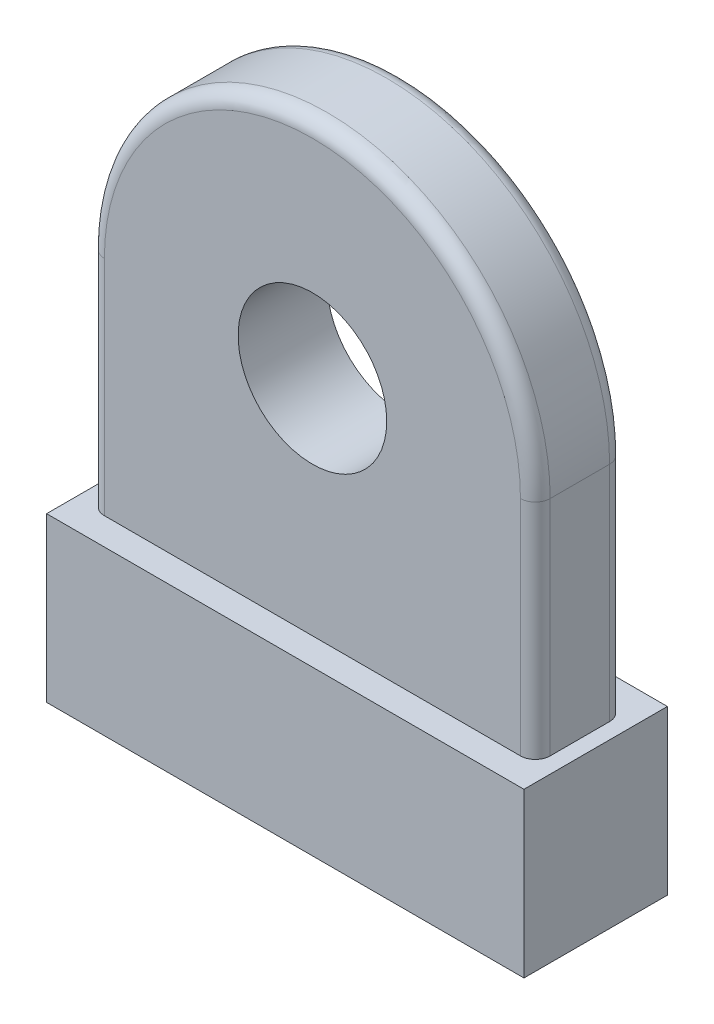
ISO-10303-21;
HEADER;
FILE_DESCRIPTION(('STEP AP214'),'2;1');
FILE_NAME('part.step','',(''),(''),'','','');
FILE_SCHEMA(('AUTOMOTIVE_DESIGN { 1 0 10303 214 1 1 1 1 }'));
ENDSEC;
DATA;
#1=APPLICATION_CONTEXT('core data for automotive mechanical design processes');
#2=APPLICATION_PROTOCOL_DEFINITION('international standard','automotive_design',2000,#1);
#3=PRODUCT_CONTEXT('',#1,'mechanical');
#4=PRODUCT('Part','Part','',(#3));
#5=PRODUCT_RELATED_PRODUCT_CATEGORY('part','',(#4));
#6=PRODUCT_DEFINITION_FORMATION('','',#4);
#7=PRODUCT_DEFINITION_CONTEXT('part definition',#1,'design');
#8=PRODUCT_DEFINITION('design','',#6,#7);
#9=PRODUCT_DEFINITION_SHAPE('','',#8);
#10=(LENGTH_UNIT() NAMED_UNIT(*) SI_UNIT(.MILLI.,.METRE.));
#11=(NAMED_UNIT(*) PLANE_ANGLE_UNIT() SI_UNIT($,.RADIAN.));
#12=(NAMED_UNIT(*) SI_UNIT($,.STERADIAN.) SOLID_ANGLE_UNIT());
#13=UNCERTAINTY_MEASURE_WITH_UNIT(LENGTH_MEASURE(1.E-05),#10,'distance_accuracy_value','');
#14=(GEOMETRIC_REPRESENTATION_CONTEXT(3) GLOBAL_UNCERTAINTY_ASSIGNED_CONTEXT((#13)) GLOBAL_UNIT_ASSIGNED_CONTEXT((#10,
#11,#12)) REPRESENTATION_CONTEXT('',''));
#15=CARTESIAN_POINT('',(0.,0.,0.));
#16=DIRECTION('',(0.,0.,1.));
#17=DIRECTION('',(1.,0.,0.));
#18=AXIS2_PLACEMENT_3D('',#15,#16,#17);
#19=CARTESIAN_POINT('',(0.,0.,6.));
#20=DIRECTION('',(0.,0.,1.));
#21=DIRECTION('',(1.,0.,0.));
#22=AXIS2_PLACEMENT_3D('',#19,#20,#21);
#23=PLANE('',#22);
#24=DIRECTION('',(1.,0.,0.));
#25=VECTOR('',#24,1.);
#26=CARTESIAN_POINT('',(-15.,-15.,6.));
#27=LINE('',#26,#25);
#28=CARTESIAN_POINT('',(-14.,-15.,6.));
#29=VERTEX_POINT('',#28);
#30=CARTESIAN_POINT('',(14.,-15.,6.));
#31=VERTEX_POINT('',#30);
#32=EDGE_CURVE('E195',#29,#31,#27,.T.);
#33=ORIENTED_EDGE('',*,*,#32,.T.);
#34=DIRECTION('',(0.,1.,0.));
#35=VECTOR('',#34,1.);
#36=CARTESIAN_POINT('',(14.,0.,6.));
#37=LINE('',#36,#35);
#38=CARTESIAN_POINT('',(14.,0.,6.));
#39=VERTEX_POINT('',#38);
#40=EDGE_CURVE('E259',#31,#39,#37,.T.);
#41=ORIENTED_EDGE('',*,*,#40,.T.);
#42=CARTESIAN_POINT('',(0.,0.,6.));
#43=DIRECTION('',(0.,0.,1.));
#44=DIRECTION('',(1.,0.,0.));
#45=AXIS2_PLACEMENT_3D('',#42,#43,#44);
#46=CIRCLE('',#45,14.);
#47=CARTESIAN_POINT('',(-14.,0.,6.));
#48=VERTEX_POINT('',#47);
#49=EDGE_CURVE('E57',#39,#48,#46,.T.);
#50=ORIENTED_EDGE('',*,*,#49,.T.);
#51=DIRECTION('',(0.,-1.,0.));
#52=VECTOR('',#51,1.);
#53=CARTESIAN_POINT('',(-14.,-15.,6.));
#54=LINE('',#53,#52);
#55=EDGE_CURVE('E256',#48,#29,#54,.T.);
#56=ORIENTED_EDGE('',*,*,#55,.T.);
#57=EDGE_LOOP('',(#33,#41,#50,#56));
#58=FACE_BOUND('',#57,.T.);
#59=CARTESIAN_POINT('',(0.,0.,6.));
#60=DIRECTION('',(0.,0.,1.));
#61=DIRECTION('',(1.,0.,0.));
#62=AXIS2_PLACEMENT_3D('',#59,#60,#61);
#63=CIRCLE('',#62,5.);
#64=CARTESIAN_POINT('',(5.,0.,6.));
#65=VERTEX_POINT('',#64);
#66=EDGE_CURVE('E185',#65,#65,#63,.T.);
#67=ORIENTED_EDGE('',*,*,#66,.F.);
#68=EDGE_LOOP('',(#67));
#69=FACE_BOUND('',#68,.T.);
#70=ADVANCED_FACE('F39',(#58,#69),#23,.T.);
#71=CARTESIAN_POINT('',(0.,0.,0.));
#72=DIRECTION('',(0.,0.,1.));
#73=DIRECTION('',(1.,0.,0.));
#74=AXIS2_PLACEMENT_3D('',#71,#72,#73);
#75=PLANE('',#74);
#76=CARTESIAN_POINT('',(0.,0.,0.));
#77=DIRECTION('',(0.,0.,1.));
#78=DIRECTION('',(1.,0.,0.));
#79=AXIS2_PLACEMENT_3D('',#76,#77,#78);
#80=CIRCLE('',#79,14.);
#81=CARTESIAN_POINT('',(-14.,0.,0.));
#82=VERTEX_POINT('',#81);
#83=CARTESIAN_POINT('',(14.,0.,0.));
#84=VERTEX_POINT('',#83);
#85=EDGE_CURVE('E223',#82,#84,#80,.F.);
#86=ORIENTED_EDGE('',*,*,#85,.T.);
#87=DIRECTION('',(0.,1.,0.));
#88=VECTOR('',#87,1.);
#89=CARTESIAN_POINT('',(14.,0.,0.));
#90=LINE('',#89,#88);
#91=CARTESIAN_POINT('',(14.,-15.,0.));
#92=VERTEX_POINT('',#91);
#93=EDGE_CURVE('E229',#84,#92,#90,.F.);
#94=ORIENTED_EDGE('',*,*,#93,.T.);
#95=DIRECTION('',(1.,0.,0.));
#96=VECTOR('',#95,1.);
#97=CARTESIAN_POINT('',(-15.,-15.,0.));
#98=LINE('',#97,#96);
#99=CARTESIAN_POINT('',(-14.,-15.,0.));
#100=VERTEX_POINT('',#99);
#101=EDGE_CURVE('E189',#100,#92,#98,.T.);
#102=ORIENTED_EDGE('',*,*,#101,.F.);
#103=DIRECTION('',(0.,-1.,0.));
#104=VECTOR('',#103,1.);
#105=CARTESIAN_POINT('',(-14.,0.,0.));
#106=LINE('',#105,#104);
#107=EDGE_CURVE('E226',#100,#82,#106,.F.);
#108=ORIENTED_EDGE('',*,*,#107,.T.);
#109=EDGE_LOOP('',(#86,#94,#102,#108));
#110=FACE_BOUND('',#109,.T.);
#111=CARTESIAN_POINT('',(0.,0.,0.));
#112=DIRECTION('',(0.,0.,1.));
#113=DIRECTION('',(1.,0.,0.));
#114=AXIS2_PLACEMENT_3D('',#111,#112,#113);
#115=CIRCLE('',#114,5.);
#116=CARTESIAN_POINT('',(5.,0.,0.));
#117=VERTEX_POINT('',#116);
#118=EDGE_CURVE('E190',#117,#117,#115,.T.);
#119=ORIENTED_EDGE('',*,*,#118,.T.);
#120=EDGE_LOOP('',(#119));
#121=FACE_BOUND('',#120,.T.);
#122=ADVANCED_FACE('F312',(#110,#121),#75,.F.);
#123=CARTESIAN_POINT('',(0.,0.,6.));
#124=DIRECTION('',(0.,0.,-1.));
#125=DIRECTION('',(-1.,0.,0.));
#126=AXIS2_PLACEMENT_3D('',#123,#124,#125);
#127=CYLINDRICAL_SURFACE('',#126,15.);
#128=DIRECTION('',(0.,0.,-1.));
#129=VECTOR('',#128,1.);
#130=CARTESIAN_POINT('',(15.,0.,6.));
#131=LINE('',#130,#129);
#132=CARTESIAN_POINT('',(15.,0.,5.));
#133=VERTEX_POINT('',#132);
#134=CARTESIAN_POINT('',(15.,0.,1.));
#135=VERTEX_POINT('',#134);
#136=EDGE_CURVE('E198',#133,#135,#131,.T.);
#137=ORIENTED_EDGE('',*,*,#136,.T.);
#138=CARTESIAN_POINT('',(0.,0.,1.));
#139=DIRECTION('',(0.,0.,1.));
#140=DIRECTION('',(1.,0.,0.));
#141=AXIS2_PLACEMENT_3D('',#138,#139,#140);
#142=CIRCLE('',#141,15.);
#143=CARTESIAN_POINT('',(-15.,0.,1.));
#144=VERTEX_POINT('',#143);
#145=EDGE_CURVE('E11',#135,#144,#142,.T.);
#146=ORIENTED_EDGE('',*,*,#145,.T.);
#147=DIRECTION('',(0.,0.,-1.));
#148=VECTOR('',#147,1.);
#149=CARTESIAN_POINT('',(-15.,0.,6.));
#150=LINE('',#149,#148);
#151=CARTESIAN_POINT('',(-15.,0.,5.));
#152=VERTEX_POINT('',#151);
#153=EDGE_CURVE('E212',#152,#144,#150,.T.);
#154=ORIENTED_EDGE('',*,*,#153,.F.);
#155=CARTESIAN_POINT('',(0.,0.,5.));
#156=DIRECTION('',(0.,0.,1.));
#157=DIRECTION('',(1.,0.,0.));
#158=AXIS2_PLACEMENT_3D('',#155,#156,#157);
#159=CIRCLE('',#158,15.);
#160=EDGE_CURVE('E49',#152,#133,#159,.F.);
#161=ORIENTED_EDGE('',*,*,#160,.T.);
#162=EDGE_LOOP('',(#137,#146,#154,#161));
#163=FACE_BOUND('',#162,.T.);
#164=ADVANCED_FACE('F303',(#163),#127,.T.);
#165=CARTESIAN_POINT('',(-15.,0.,6.));
#166=DIRECTION('',(1.,0.,0.));
#167=DIRECTION('',(0.,1.,0.));
#168=AXIS2_PLACEMENT_3D('',#165,#166,#167);
#169=PLANE('',#168);
#170=ORIENTED_EDGE('',*,*,#153,.T.);
#171=DIRECTION('',(0.,-1.,0.));
#172=VECTOR('',#171,1.);
#173=CARTESIAN_POINT('',(-15.,0.,1.));
#174=LINE('',#173,#172);
#175=CARTESIAN_POINT('',(-15.,-15.,1.));
#176=VERTEX_POINT('',#175);
#177=EDGE_CURVE('E251',#144,#176,#174,.T.);
#178=ORIENTED_EDGE('',*,*,#177,.T.);
#179=DIRECTION('',(0.,0.,-1.));
#180=VECTOR('',#179,1.);
#181=CARTESIAN_POINT('',(-15.,-15.,6.));
#182=LINE('',#181,#180);
#183=CARTESIAN_POINT('',(-15.,-15.,5.));
#184=VERTEX_POINT('',#183);
#185=EDGE_CURVE('E208',#184,#176,#182,.T.);
#186=ORIENTED_EDGE('',*,*,#185,.F.);
#187=DIRECTION('',(0.,-1.,0.));
#188=VECTOR('',#187,1.);
#189=CARTESIAN_POINT('',(-15.,0.,5.));
#190=LINE('',#189,#188);
#191=EDGE_CURVE('E248',#184,#152,#190,.F.);
#192=ORIENTED_EDGE('',*,*,#191,.T.);
#193=EDGE_LOOP('',(#170,#178,#186,#192));
#194=FACE_BOUND('',#193,.T.);
#195=ADVANCED_FACE('F306',(#194),#169,.F.);
#196=CARTESIAN_POINT('',(15.,-15.,6.));
#197=DIRECTION('',(-1.,0.,0.));
#198=DIRECTION('',(0.,-1.,0.));
#199=AXIS2_PLACEMENT_3D('',#196,#197,#198);
#200=PLANE('',#199);
#201=DIRECTION('',(0.,0.,-1.));
#202=VECTOR('',#201,1.);
#203=CARTESIAN_POINT('',(15.,-15.,6.));
#204=LINE('',#203,#202);
#205=CARTESIAN_POINT('',(15.,-15.,5.));
#206=VERTEX_POINT('',#205);
#207=CARTESIAN_POINT('',(15.,-15.,1.));
#208=VERTEX_POINT('',#207);
#209=EDGE_CURVE('E205',#206,#208,#204,.T.);
#210=ORIENTED_EDGE('',*,*,#209,.T.);
#211=DIRECTION('',(0.,1.,0.));
#212=VECTOR('',#211,1.);
#213=CARTESIAN_POINT('',(15.,-15.,1.));
#214=LINE('',#213,#212);
#215=EDGE_CURVE('E219',#208,#135,#214,.T.);
#216=ORIENTED_EDGE('',*,*,#215,.T.);
#217=ORIENTED_EDGE('',*,*,#136,.F.);
#218=DIRECTION('',(0.,1.,0.));
#219=VECTOR('',#218,1.);
#220=CARTESIAN_POINT('',(15.,-15.,5.));
#221=LINE('',#220,#219);
#222=EDGE_CURVE('E216',#133,#206,#221,.F.);
#223=ORIENTED_EDGE('',*,*,#222,.T.);
#224=EDGE_LOOP('',(#210,#216,#217,#223));
#225=FACE_BOUND('',#224,.T.);
#226=ADVANCED_FACE('F290',(#225),#200,.F.);
#227=CARTESIAN_POINT('',(0.,0.,6.));
#228=DIRECTION('',(0.,0.,-1.));
#229=DIRECTION('',(-1.,0.,0.));
#230=AXIS2_PLACEMENT_3D('',#227,#228,#229);
#231=CYLINDRICAL_SURFACE('',#230,5.);
#232=ORIENTED_EDGE('',*,*,#66,.T.);
#233=EDGE_LOOP('',(#232));
#234=FACE_BOUND('',#233,.T.);
#235=ORIENTED_EDGE('',*,*,#118,.F.);
#236=EDGE_LOOP('',(#235));
#237=FACE_BOUND('',#236,.T.);
#238=ADVANCED_FACE('F318',(#234,#237),#231,.F.);
#239=CARTESIAN_POINT('',(-14.,0.,1.));
#240=DIRECTION('',(0.,-1.,0.));
#241=DIRECTION('',(1.,0.,0.));
#242=AXIS2_PLACEMENT_3D('',#239,#240,#241);
#243=CYLINDRICAL_SURFACE('',#242,1.);
#244=CARTESIAN_POINT('',(-14.,-15.,1.));
#245=DIRECTION('',(0.,1.,0.));
#246=DIRECTION('',(0.,0.,1.));
#247=AXIS2_PLACEMENT_3D('',#244,#245,#246);
#248=CIRCLE('',#247,1.);
#249=EDGE_CURVE('E240',#176,#100,#248,.F.);
#250=ORIENTED_EDGE('',*,*,#249,.F.);
#251=ORIENTED_EDGE('',*,*,#177,.F.);
#252=CARTESIAN_POINT('',(-14.,0.,1.));
#253=DIRECTION('',(0.,1.,0.));
#254=DIRECTION('',(-1.,0.,0.));
#255=AXIS2_PLACEMENT_3D('',#252,#253,#254);
#256=CIRCLE('',#255,1.);
#257=EDGE_CURVE('E194',#82,#144,#256,.T.);
#258=ORIENTED_EDGE('',*,*,#257,.F.);
#259=ORIENTED_EDGE('',*,*,#107,.F.);
#260=EDGE_LOOP('',(#250,#251,#258,#259));
#261=FACE_BOUND('',#260,.T.);
#262=ADVANCED_FACE('F309',(#261),#243,.T.);
#263=CARTESIAN_POINT('',(0.,0.,1.));
#264=DIRECTION('',(0.,0.,1.));
#265=DIRECTION('',(1.,0.,0.));
#266=AXIS2_PLACEMENT_3D('',#263,#264,#265);
#267=TOROIDAL_SURFACE('',#266,14.,1.);
#268=ORIENTED_EDGE('',*,*,#257,.T.);
#269=ORIENTED_EDGE('',*,*,#145,.F.);
#270=CARTESIAN_POINT('',(14.,0.,1.));
#271=DIRECTION('',(0.,-1.,0.));
#272=DIRECTION('',(1.,0.,0.));
#273=AXIS2_PLACEMENT_3D('',#270,#271,#272);
#274=CIRCLE('',#273,1.);
#275=EDGE_CURVE('E264',#84,#135,#274,.T.);
#276=ORIENTED_EDGE('',*,*,#275,.F.);
#277=ORIENTED_EDGE('',*,*,#85,.F.);
#278=EDGE_LOOP('',(#268,#269,#276,#277));
#279=FACE_BOUND('',#278,.T.);
#280=ADVANCED_FACE('F299',(#279),#267,.T.);
#281=CARTESIAN_POINT('',(14.,-15.,1.));
#282=DIRECTION('',(0.,1.,0.));
#283=DIRECTION('',(-1.,0.,0.));
#284=AXIS2_PLACEMENT_3D('',#281,#282,#283);
#285=CYLINDRICAL_SURFACE('',#284,1.);
#286=CARTESIAN_POINT('',(14.,-15.,1.));
#287=DIRECTION('',(0.,1.,0.));
#288=DIRECTION('',(0.,0.,1.));
#289=AXIS2_PLACEMENT_3D('',#286,#287,#288);
#290=CIRCLE('',#289,1.);
#291=EDGE_CURVE('E244',#92,#208,#290,.F.);
#292=ORIENTED_EDGE('',*,*,#291,.F.);
#293=ORIENTED_EDGE('',*,*,#93,.F.);
#294=ORIENTED_EDGE('',*,*,#275,.T.);
#295=ORIENTED_EDGE('',*,*,#215,.F.);
#296=EDGE_LOOP('',(#292,#293,#294,#295));
#297=FACE_BOUND('',#296,.T.);
#298=ADVANCED_FACE('F293',(#297),#285,.T.);
#299=CARTESIAN_POINT('',(-14.,0.,5.));
#300=DIRECTION('',(0.,1.,0.));
#301=DIRECTION('',(-1.,0.,0.));
#302=AXIS2_PLACEMENT_3D('',#299,#300,#301);
#303=CYLINDRICAL_SURFACE('',#302,1.);
#304=CARTESIAN_POINT('',(-14.,-15.,5.));
#305=DIRECTION('',(0.,1.,0.));
#306=DIRECTION('',(0.,0.,1.));
#307=AXIS2_PLACEMENT_3D('',#304,#305,#306);
#308=CIRCLE('',#307,1.);
#309=EDGE_CURVE('E232',#29,#184,#308,.F.);
#310=ORIENTED_EDGE('',*,*,#309,.F.);
#311=ORIENTED_EDGE('',*,*,#55,.F.);
#312=CARTESIAN_POINT('',(-14.,0.,5.));
#313=DIRECTION('',(0.,1.,0.));
#314=DIRECTION('',(-1.,0.,0.));
#315=AXIS2_PLACEMENT_3D('',#312,#313,#314);
#316=CIRCLE('',#315,1.);
#317=EDGE_CURVE('E43',#152,#48,#316,.T.);
#318=ORIENTED_EDGE('',*,*,#317,.F.);
#319=ORIENTED_EDGE('',*,*,#191,.F.);
#320=EDGE_LOOP('',(#310,#311,#318,#319));
#321=FACE_BOUND('',#320,.T.);
#322=ADVANCED_FACE('F41',(#321),#303,.T.);
#323=CARTESIAN_POINT('',(0.,0.,5.));
#324=DIRECTION('',(0.,0.,1.));
#325=DIRECTION('',(1.,0.,0.));
#326=AXIS2_PLACEMENT_3D('',#323,#324,#325);
#327=TOROIDAL_SURFACE('',#326,14.,1.);
#328=ORIENTED_EDGE('',*,*,#317,.T.);
#329=ORIENTED_EDGE('',*,*,#49,.F.);
#330=CARTESIAN_POINT('',(14.,0.,5.));
#331=DIRECTION('',(0.,-1.,0.));
#332=DIRECTION('',(0.,0.,-1.));
#333=AXIS2_PLACEMENT_3D('',#330,#331,#332);
#334=CIRCLE('',#333,1.);
#335=EDGE_CURVE('E65',#133,#39,#334,.T.);
#336=ORIENTED_EDGE('',*,*,#335,.F.);
#337=ORIENTED_EDGE('',*,*,#160,.F.);
#338=EDGE_LOOP('',(#328,#329,#336,#337));
#339=FACE_BOUND('',#338,.T.);
#340=ADVANCED_FACE('F275',(#339),#327,.T.);
#341=CARTESIAN_POINT('',(14.,0.,5.));
#342=DIRECTION('',(0.,-1.,0.));
#343=DIRECTION('',(1.,0.,0.));
#344=AXIS2_PLACEMENT_3D('',#341,#342,#343);
#345=CYLINDRICAL_SURFACE('',#344,1.);
#346=CARTESIAN_POINT('',(14.,-15.,5.));
#347=DIRECTION('',(0.,1.,0.));
#348=DIRECTION('',(0.,0.,1.));
#349=AXIS2_PLACEMENT_3D('',#346,#347,#348);
#350=CIRCLE('',#349,1.);
#351=EDGE_CURVE('E236',#206,#31,#350,.F.);
#352=ORIENTED_EDGE('',*,*,#351,.F.);
#353=ORIENTED_EDGE('',*,*,#222,.F.);
#354=ORIENTED_EDGE('',*,*,#335,.T.);
#355=ORIENTED_EDGE('',*,*,#40,.F.);
#356=EDGE_LOOP('',(#352,#353,#354,#355));
#357=FACE_BOUND('',#356,.T.);
#358=ADVANCED_FACE('F283',(#357),#345,.T.);
#359=CARTESIAN_POINT('',(-16.0627497726789,-26.,-1.8261868368202));
#360=DIRECTION('',(-1.,0.,0.));
#361=DIRECTION('',(0.,0.,1.));
#362=AXIS2_PLACEMENT_3D('',#359,#360,#361);
#363=PLANE('',#362);
#364=DIRECTION('',(0.,0.,1.));
#365=VECTOR('',#364,1.);
#366=CARTESIAN_POINT('',(-16.0627497726789,-15.,-1.8261868368202));
#367=LINE('',#366,#365);
#368=CARTESIAN_POINT('',(-16.0627497726789,-15.,-1.8261868368202));
#369=VERTEX_POINT('',#368);
#370=CARTESIAN_POINT('',(-16.0627497726789,-15.,7.8261868368202));
#371=VERTEX_POINT('',#370);
#372=EDGE_CURVE('E169',#369,#371,#367,.T.);
#373=ORIENTED_EDGE('',*,*,#372,.F.);
#374=DIRECTION('',(0.,1.,0.));
#375=VECTOR('',#374,1.);
#376=CARTESIAN_POINT('',(-16.0627497726789,-26.,-1.8261868368202));
#377=LINE('',#376,#375);
#378=CARTESIAN_POINT('',(-16.0627497726789,-26.,-1.8261868368202));
#379=VERTEX_POINT('',#378);
#380=EDGE_CURVE('E156',#379,#369,#377,.T.);
#381=ORIENTED_EDGE('',*,*,#380,.F.);
#382=DIRECTION('',(0.,0.,1.));
#383=VECTOR('',#382,1.);
#384=CARTESIAN_POINT('',(-16.0627497726789,-26.,-1.8261868368202));
#385=LINE('',#384,#383);
#386=CARTESIAN_POINT('',(-16.0627497726789,-26.,7.8261868368202));
#387=VERTEX_POINT('',#386);
#388=EDGE_CURVE('E149',#379,#387,#385,.T.);
#389=ORIENTED_EDGE('',*,*,#388,.T.);
#390=DIRECTION('',(0.,1.,0.));
#391=VECTOR('',#390,1.);
#392=CARTESIAN_POINT('',(-16.0627497726789,-26.,7.8261868368202));
#393=LINE('',#392,#391);
#394=EDGE_CURVE('E132',#387,#371,#393,.T.);
#395=ORIENTED_EDGE('',*,*,#394,.T.);
#396=EDGE_LOOP('',(#373,#381,#389,#395));
#397=FACE_BOUND('',#396,.T.);
#398=ADVANCED_FACE('F155',(#397),#363,.T.);
#399=CARTESIAN_POINT('',(-16.0627497726789,-26.,-1.8261868368202));
#400=DIRECTION('',(0.,0.,1.));
#401=DIRECTION('',(1.,0.,0.));
#402=AXIS2_PLACEMENT_3D('',#399,#400,#401);
#403=PLANE('',#402);
#404=DIRECTION('',(1.,0.,0.));
#405=VECTOR('',#404,1.);
#406=CARTESIAN_POINT('',(-16.0627497726789,-15.,-1.8261868368202));
#407=LINE('',#406,#405);
#408=CARTESIAN_POINT('',(16.0627497726789,-15.,-1.8261868368202));
#409=VERTEX_POINT('',#408);
#410=EDGE_CURVE('E159',#369,#409,#407,.T.);
#411=ORIENTED_EDGE('',*,*,#410,.T.);
#412=DIRECTION('',(0.,1.,0.));
#413=VECTOR('',#412,1.);
#414=CARTESIAN_POINT('',(16.0627497726789,-26.,-1.8261868368202));
#415=LINE('',#414,#413);
#416=CARTESIAN_POINT('',(16.0627497726789,-26.,-1.8261868368202));
#417=VERTEX_POINT('',#416);
#418=EDGE_CURVE('E179',#417,#409,#415,.T.);
#419=ORIENTED_EDGE('',*,*,#418,.F.);
#420=DIRECTION('',(1.,0.,0.));
#421=VECTOR('',#420,1.);
#422=CARTESIAN_POINT('',(-16.0627497726789,-26.,-1.8261868368202));
#423=LINE('',#422,#421);
#424=EDGE_CURVE('E144',#379,#417,#423,.T.);
#425=ORIENTED_EDGE('',*,*,#424,.F.);
#426=ORIENTED_EDGE('',*,*,#380,.T.);
#427=EDGE_LOOP('',(#411,#419,#425,#426));
#428=FACE_BOUND('',#427,.T.);
#429=ADVANCED_FACE('F407',(#428),#403,.F.);
#430=CARTESIAN_POINT('',(16.0627497726789,-26.,-1.8261868368202));
#431=DIRECTION('',(-1.,0.,0.));
#432=DIRECTION('',(0.,0.,1.));
#433=AXIS2_PLACEMENT_3D('',#430,#431,#432);
#434=PLANE('',#433);
#435=DIRECTION('',(0.,0.,1.));
#436=VECTOR('',#435,1.);
#437=CARTESIAN_POINT('',(16.0627497726789,-15.,-1.8261868368202));
#438=LINE('',#437,#436);
#439=CARTESIAN_POINT('',(16.0627497726789,-15.,7.8261868368202));
#440=VERTEX_POINT('',#439);
#441=EDGE_CURVE('E162',#409,#440,#438,.T.);
#442=ORIENTED_EDGE('',*,*,#441,.T.);
#443=DIRECTION('',(0.,1.,0.));
#444=VECTOR('',#443,1.);
#445=CARTESIAN_POINT('',(16.0627497726789,-26.,7.8261868368202));
#446=LINE('',#445,#444);
#447=CARTESIAN_POINT('',(16.0627497726789,-26.,7.8261868368202));
#448=VERTEX_POINT('',#447);
#449=EDGE_CURVE('E143',#448,#440,#446,.T.);
#450=ORIENTED_EDGE('',*,*,#449,.F.);
#451=DIRECTION('',(0.,0.,1.));
#452=VECTOR('',#451,1.);
#453=CARTESIAN_POINT('',(16.0627497726789,-26.,-1.8261868368202));
#454=LINE('',#453,#452);
#455=EDGE_CURVE('E151',#417,#448,#454,.T.);
#456=ORIENTED_EDGE('',*,*,#455,.F.);
#457=ORIENTED_EDGE('',*,*,#418,.T.);
#458=EDGE_LOOP('',(#442,#450,#456,#457));
#459=FACE_BOUND('',#458,.T.);
#460=ADVANCED_FACE('F414',(#459),#434,.F.);
#461=CARTESIAN_POINT('',(-16.0627497726789,-26.,7.8261868368202));
#462=DIRECTION('',(0.,0.,1.));
#463=DIRECTION('',(1.,0.,0.));
#464=AXIS2_PLACEMENT_3D('',#461,#462,#463);
#465=PLANE('',#464);
#466=DIRECTION('',(1.,0.,0.));
#467=VECTOR('',#466,1.);
#468=CARTESIAN_POINT('',(-16.0627497726789,-15.,7.8261868368202));
#469=LINE('',#468,#467);
#470=EDGE_CURVE('E137',#371,#440,#469,.T.);
#471=ORIENTED_EDGE('',*,*,#470,.F.);
#472=ORIENTED_EDGE('',*,*,#394,.F.);
#473=DIRECTION('',(1.,0.,0.));
#474=VECTOR('',#473,1.);
#475=CARTESIAN_POINT('',(-16.0627497726789,-26.,7.8261868368202));
#476=LINE('',#475,#474);
#477=EDGE_CURVE('E135',#387,#448,#476,.T.);
#478=ORIENTED_EDGE('',*,*,#477,.T.);
#479=ORIENTED_EDGE('',*,*,#449,.T.);
#480=EDGE_LOOP('',(#471,#472,#478,#479));
#481=FACE_BOUND('',#480,.T.);
#482=ADVANCED_FACE('F134',(#481),#465,.T.);
#483=CARTESIAN_POINT('',(0.,-26.,0.));
#484=DIRECTION('',(0.,1.,0.));
#485=DIRECTION('',(0.,0.,1.));
#486=AXIS2_PLACEMENT_3D('',#483,#484,#485);
#487=PLANE('',#486);
#488=ORIENTED_EDGE('',*,*,#388,.F.);
#489=ORIENTED_EDGE('',*,*,#424,.T.);
#490=ORIENTED_EDGE('',*,*,#455,.T.);
#491=ORIENTED_EDGE('',*,*,#477,.F.);
#492=EDGE_LOOP('',(#488,#489,#490,#491));
#493=FACE_BOUND('',#492,.T.);
#494=ADVANCED_FACE('F148',(#493),#487,.F.);
#495=CARTESIAN_POINT('',(0.,-15.,0.));
#496=DIRECTION('',(0.,1.,0.));
#497=DIRECTION('',(0.,0.,1.));
#498=AXIS2_PLACEMENT_3D('',#495,#496,#497);
#499=PLANE('',#498);
#500=ORIENTED_EDGE('',*,*,#249,.T.);
#501=ORIENTED_EDGE('',*,*,#101,.T.);
#502=ORIENTED_EDGE('',*,*,#291,.T.);
#503=ORIENTED_EDGE('',*,*,#209,.F.);
#504=ORIENTED_EDGE('',*,*,#351,.T.);
#505=ORIENTED_EDGE('',*,*,#32,.F.);
#506=ORIENTED_EDGE('',*,*,#309,.T.);
#507=ORIENTED_EDGE('',*,*,#185,.T.);
#508=EDGE_LOOP('',(#500,#501,#502,#503,#504,#505,#506,#507));
#509=FACE_BOUND('',#508,.T.);
#510=ORIENTED_EDGE('',*,*,#372,.T.);
#511=ORIENTED_EDGE('',*,*,#470,.T.);
#512=ORIENTED_EDGE('',*,*,#441,.F.);
#513=ORIENTED_EDGE('',*,*,#410,.F.);
#514=EDGE_LOOP('',(#510,#511,#512,#513));
#515=FACE_BOUND('',#514,.T.);
#516=ADVANCED_FACE('F285',(#509,#515),#499,.T.);
#517=CLOSED_SHELL('',(#70,#122,#164,#195,#226,#238,#262,#280,#298,#322,#340,#358,#398,#429,#460,
#482,#494,#516));
#518=MANIFOLD_SOLID_BREP('B2',#517);
#519=ADVANCED_BREP_SHAPE_REPRESENTATION('',(#18,#518),#14);
#520=SHAPE_DEFINITION_REPRESENTATION(#9,#519);
ENDSEC;
END-ISO-10303-21;
